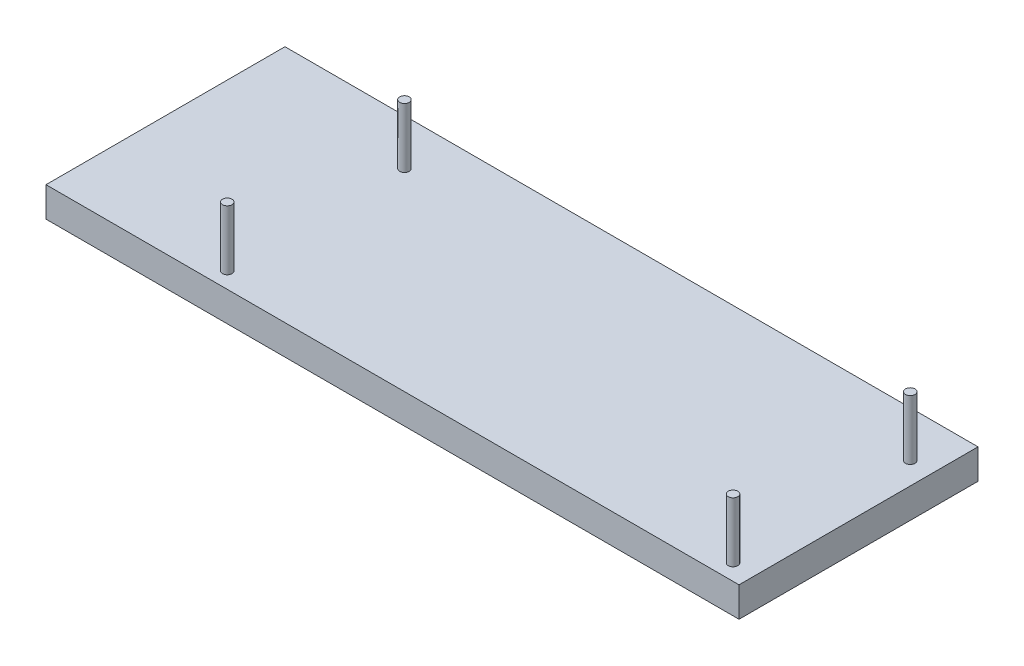
ISO-10303-21;
HEADER;
FILE_DESCRIPTION(('STEP AP214'),'2;1');
FILE_NAME('part.step','',(''),(''),'','','');
FILE_SCHEMA(('AUTOMOTIVE_DESIGN { 1 0 10303 214 1 1 1 1 }'));
ENDSEC;
DATA;
#1=APPLICATION_CONTEXT('core data for automotive mechanical design processes');
#2=APPLICATION_PROTOCOL_DEFINITION('international standard','automotive_design',2000,#1);
#3=PRODUCT_CONTEXT('',#1,'mechanical');
#4=PRODUCT('Part','Part','',(#3));
#5=PRODUCT_RELATED_PRODUCT_CATEGORY('part','',(#4));
#6=PRODUCT_DEFINITION_FORMATION('','',#4);
#7=PRODUCT_DEFINITION_CONTEXT('part definition',#1,'design');
#8=PRODUCT_DEFINITION('design','',#6,#7);
#9=PRODUCT_DEFINITION_SHAPE('','',#8);
#10=(LENGTH_UNIT() NAMED_UNIT(*) SI_UNIT(.MILLI.,.METRE.));
#11=(NAMED_UNIT(*) PLANE_ANGLE_UNIT() SI_UNIT($,.RADIAN.));
#12=(NAMED_UNIT(*) SI_UNIT($,.STERADIAN.) SOLID_ANGLE_UNIT());
#13=UNCERTAINTY_MEASURE_WITH_UNIT(LENGTH_MEASURE(1.E-05),#10,'distance_accuracy_value','');
#14=(GEOMETRIC_REPRESENTATION_CONTEXT(3) GLOBAL_UNCERTAINTY_ASSIGNED_CONTEXT((#13)) GLOBAL_UNIT_ASSIGNED_CONTEXT((#10,
#11,#12)) REPRESENTATION_CONTEXT('',''));
#15=CARTESIAN_POINT('',(0.,0.,0.));
#16=DIRECTION('',(0.,0.,1.));
#17=DIRECTION('',(1.,0.,0.));
#18=AXIS2_PLACEMENT_3D('',#15,#16,#17);
#19=CARTESIAN_POINT('',(-58.,5.,-40.));
#20=DIRECTION('',(1.,0.,0.));
#21=DIRECTION('',(0.,0.,-1.));
#22=AXIS2_PLACEMENT_3D('',#19,#20,#21);
#23=PLANE('',#22);
#24=DIRECTION('',(0.,0.,1.));
#25=VECTOR('',#24,1.);
#26=CARTESIAN_POINT('',(-58.,0.,-40.));
#27=LINE('',#26,#25);
#28=CARTESIAN_POINT('',(-58.,0.,-40.));
#29=VERTEX_POINT('',#28);
#30=CARTESIAN_POINT('',(-58.,0.,0.));
#31=VERTEX_POINT('',#30);
#32=EDGE_CURVE('E96',#29,#31,#27,.T.);
#33=ORIENTED_EDGE('',*,*,#32,.T.);
#34=DIRECTION('',(0.,-1.,0.));
#35=VECTOR('',#34,1.);
#36=CARTESIAN_POINT('',(-58.,5.,0.));
#37=LINE('',#36,#35);
#38=CARTESIAN_POINT('',(-58.,5.,0.));
#39=VERTEX_POINT('',#38);
#40=EDGE_CURVE('E11',#39,#31,#37,.T.);
#41=ORIENTED_EDGE('',*,*,#40,.F.);
#42=DIRECTION('',(0.,0.,1.));
#43=VECTOR('',#42,1.);
#44=CARTESIAN_POINT('',(-58.,5.,-40.));
#45=LINE('',#44,#43);
#46=CARTESIAN_POINT('',(-58.,5.,-40.));
#47=VERTEX_POINT('',#46);
#48=EDGE_CURVE('E84',#47,#39,#45,.T.);
#49=ORIENTED_EDGE('',*,*,#48,.F.);
#50=DIRECTION('',(0.,-1.,0.));
#51=VECTOR('',#50,1.);
#52=CARTESIAN_POINT('',(-58.,5.,-40.));
#53=LINE('',#52,#51);
#54=EDGE_CURVE('E92',#47,#29,#53,.T.);
#55=ORIENTED_EDGE('',*,*,#54,.T.);
#56=EDGE_LOOP('',(#33,#41,#49,#55));
#57=FACE_BOUND('',#56,.T.);
#58=ADVANCED_FACE('F33',(#57),#23,.F.);
#59=CARTESIAN_POINT('',(-58.,5.,0.));
#60=DIRECTION('',(0.,0.,-1.));
#61=DIRECTION('',(-1.,0.,0.));
#62=AXIS2_PLACEMENT_3D('',#59,#60,#61);
#63=PLANE('',#62);
#64=DIRECTION('',(1.,0.,0.));
#65=VECTOR('',#64,1.);
#66=CARTESIAN_POINT('',(-58.,0.,0.));
#67=LINE('',#66,#65);
#68=CARTESIAN_POINT('',(58.,0.,0.));
#69=VERTEX_POINT('',#68);
#70=EDGE_CURVE('E88',#31,#69,#67,.T.);
#71=ORIENTED_EDGE('',*,*,#70,.T.);
#72=DIRECTION('',(0.,-1.,0.));
#73=VECTOR('',#72,1.);
#74=CARTESIAN_POINT('',(58.,5.,0.));
#75=LINE('',#74,#73);
#76=CARTESIAN_POINT('',(58.,5.,0.));
#77=VERTEX_POINT('',#76);
#78=EDGE_CURVE('E41',#77,#69,#75,.T.);
#79=ORIENTED_EDGE('',*,*,#78,.F.);
#80=DIRECTION('',(1.,0.,0.));
#81=VECTOR('',#80,1.);
#82=CARTESIAN_POINT('',(-58.,5.,0.));
#83=LINE('',#82,#81);
#84=EDGE_CURVE('E79',#39,#77,#83,.T.);
#85=ORIENTED_EDGE('',*,*,#84,.F.);
#86=ORIENTED_EDGE('',*,*,#40,.T.);
#87=EDGE_LOOP('',(#71,#79,#85,#86));
#88=FACE_BOUND('',#87,.T.);
#89=ADVANCED_FACE('F87',(#88),#63,.F.);
#90=CARTESIAN_POINT('',(58.,5.,-40.));
#91=DIRECTION('',(-1.,0.,0.));
#92=DIRECTION('',(0.,0.,1.));
#93=AXIS2_PLACEMENT_3D('',#90,#91,#92);
#94=PLANE('',#93);
#95=DIRECTION('',(0.,0.,-1.));
#96=VECTOR('',#95,1.);
#97=CARTESIAN_POINT('',(58.,0.,-40.));
#98=LINE('',#97,#96);
#99=CARTESIAN_POINT('',(58.,0.,-40.));
#100=VERTEX_POINT('',#99);
#101=EDGE_CURVE('E66',#69,#100,#98,.T.);
#102=ORIENTED_EDGE('',*,*,#101,.T.);
#103=DIRECTION('',(0.,-1.,0.));
#104=VECTOR('',#103,1.);
#105=CARTESIAN_POINT('',(58.,5.,-40.));
#106=LINE('',#105,#104);
#107=CARTESIAN_POINT('',(58.,5.,-40.));
#108=VERTEX_POINT('',#107);
#109=EDGE_CURVE('E89',#108,#100,#106,.T.);
#110=ORIENTED_EDGE('',*,*,#109,.F.);
#111=DIRECTION('',(0.,0.,-1.));
#112=VECTOR('',#111,1.);
#113=CARTESIAN_POINT('',(58.,5.,-40.));
#114=LINE('',#113,#112);
#115=EDGE_CURVE('E82',#77,#108,#114,.T.);
#116=ORIENTED_EDGE('',*,*,#115,.F.);
#117=ORIENTED_EDGE('',*,*,#78,.T.);
#118=EDGE_LOOP('',(#102,#110,#116,#117));
#119=FACE_BOUND('',#118,.T.);
#120=ADVANCED_FACE('F90',(#119),#94,.F.);
#121=CARTESIAN_POINT('',(-58.,5.,-40.));
#122=DIRECTION('',(0.,0.,1.));
#123=DIRECTION('',(1.,0.,0.));
#124=AXIS2_PLACEMENT_3D('',#121,#122,#123);
#125=PLANE('',#124);
#126=DIRECTION('',(-1.,0.,0.));
#127=VECTOR('',#126,1.);
#128=CARTESIAN_POINT('',(-58.,0.,-40.));
#129=LINE('',#128,#127);
#130=EDGE_CURVE('E72',#100,#29,#129,.T.);
#131=ORIENTED_EDGE('',*,*,#130,.T.);
#132=ORIENTED_EDGE('',*,*,#54,.F.);
#133=DIRECTION('',(-1.,0.,0.));
#134=VECTOR('',#133,1.);
#135=CARTESIAN_POINT('',(-58.,5.,-40.));
#136=LINE('',#135,#134);
#137=EDGE_CURVE('E49',#108,#47,#136,.T.);
#138=ORIENTED_EDGE('',*,*,#137,.F.);
#139=ORIENTED_EDGE('',*,*,#109,.T.);
#140=EDGE_LOOP('',(#131,#132,#138,#139));
#141=FACE_BOUND('',#140,.T.);
#142=ADVANCED_FACE('F104',(#141),#125,.F.);
#143=CARTESIAN_POINT('',(0.,5.,0.));
#144=DIRECTION('',(0.,1.,0.));
#145=DIRECTION('',(0.,0.,1.));
#146=AXIS2_PLACEMENT_3D('',#143,#144,#145);
#147=PLANE('',#146);
#148=CARTESIAN_POINT('',(-30.33,5.,-32.33));
#149=DIRECTION('',(0.,1.,0.));
#150=DIRECTION('',(0.,0.,1.));
#151=AXIS2_PLACEMENT_3D('',#148,#149,#150);
#152=CIRCLE('',#151,0.800000000000003);
#153=CARTESIAN_POINT('',(-30.33,5.,-31.53));
#154=VERTEX_POINT('',#153);
#155=EDGE_CURVE('E125',#154,#154,#152,.T.);
#156=ORIENTED_EDGE('',*,*,#155,.F.);
#157=EDGE_LOOP('',(#156));
#158=FACE_BOUND('',#157,.T.);
#159=CARTESIAN_POINT('',(-30.33,5.,-2.67));
#160=DIRECTION('',(0.,1.,0.));
#161=DIRECTION('',(0.,0.,1.));
#162=AXIS2_PLACEMENT_3D('',#159,#160,#161);
#163=CIRCLE('',#162,0.800000000000003);
#164=CARTESIAN_POINT('',(-30.33,5.,-1.87));
#165=VERTEX_POINT('',#164);
#166=EDGE_CURVE('E119',#165,#165,#163,.T.);
#167=ORIENTED_EDGE('',*,*,#166,.F.);
#168=EDGE_LOOP('',(#167));
#169=FACE_BOUND('',#168,.T.);
#170=CARTESIAN_POINT('',(54.33,5.,-32.33));
#171=DIRECTION('',(0.,1.,0.));
#172=DIRECTION('',(0.,0.,1.));
#173=AXIS2_PLACEMENT_3D('',#170,#171,#172);
#174=CIRCLE('',#173,0.800000000000003);
#175=CARTESIAN_POINT('',(54.33,5.,-31.53));
#176=VERTEX_POINT('',#175);
#177=EDGE_CURVE('E113',#176,#176,#174,.T.);
#178=ORIENTED_EDGE('',*,*,#177,.F.);
#179=EDGE_LOOP('',(#178));
#180=FACE_BOUND('',#179,.T.);
#181=CARTESIAN_POINT('',(54.33,5.,-2.67));
#182=DIRECTION('',(0.,1.,0.));
#183=DIRECTION('',(0.,0.,1.));
#184=AXIS2_PLACEMENT_3D('',#181,#182,#183);
#185=CIRCLE('',#184,0.800000000000003);
#186=CARTESIAN_POINT('',(54.33,5.,-1.87));
#187=VERTEX_POINT('',#186);
#188=EDGE_CURVE('E110',#187,#187,#185,.T.);
#189=ORIENTED_EDGE('',*,*,#188,.F.);
#190=EDGE_LOOP('',(#189));
#191=FACE_BOUND('',#190,.T.);
#192=ORIENTED_EDGE('',*,*,#48,.T.);
#193=ORIENTED_EDGE('',*,*,#84,.T.);
#194=ORIENTED_EDGE('',*,*,#115,.T.);
#195=ORIENTED_EDGE('',*,*,#137,.T.);
#196=EDGE_LOOP('',(#192,#193,#194,#195));
#197=FACE_BOUND('',#196,.T.);
#198=ADVANCED_FACE('F80',(#158,#169,#180,#191,#197),#147,.T.);
#199=CARTESIAN_POINT('',(0.,0.,0.));
#200=DIRECTION('',(0.,1.,0.));
#201=DIRECTION('',(0.,0.,1.));
#202=AXIS2_PLACEMENT_3D('',#199,#200,#201);
#203=PLANE('',#202);
#204=ORIENTED_EDGE('',*,*,#32,.F.);
#205=ORIENTED_EDGE('',*,*,#130,.F.);
#206=ORIENTED_EDGE('',*,*,#101,.F.);
#207=ORIENTED_EDGE('',*,*,#70,.F.);
#208=EDGE_LOOP('',(#204,#205,#206,#207));
#209=FACE_BOUND('',#208,.T.);
#210=ADVANCED_FACE('F107',(#209),#203,.F.);
#211=CARTESIAN_POINT('',(54.33,15.,-2.67));
#212=DIRECTION('',(0.,-1.,0.));
#213=DIRECTION('',(0.,0.,-1.));
#214=AXIS2_PLACEMENT_3D('',#211,#212,#213);
#215=CYLINDRICAL_SURFACE('',#214,0.800000000000003);
#216=CARTESIAN_POINT('',(54.33,15.,-2.67));
#217=DIRECTION('',(0.,1.,0.));
#218=DIRECTION('',(0.,0.,1.));
#219=AXIS2_PLACEMENT_3D('',#216,#217,#218);
#220=CIRCLE('',#219,0.800000000000003);
#221=CARTESIAN_POINT('',(54.33,15.,-1.87));
#222=VERTEX_POINT('',#221);
#223=EDGE_CURVE('E99',#222,#222,#220,.T.);
#224=ORIENTED_EDGE('',*,*,#223,.F.);
#225=EDGE_LOOP('',(#224));
#226=FACE_BOUND('',#225,.T.);
#227=ORIENTED_EDGE('',*,*,#188,.T.);
#228=EDGE_LOOP('',(#227));
#229=FACE_BOUND('',#228,.T.);
#230=ADVANCED_FACE('F145',(#226,#229),#215,.T.);
#231=CARTESIAN_POINT('',(54.33,15.,-2.67));
#232=DIRECTION('',(0.,1.,0.));
#233=DIRECTION('',(0.,0.,1.));
#234=AXIS2_PLACEMENT_3D('',#231,#232,#233);
#235=PLANE('',#234);
#236=ORIENTED_EDGE('',*,*,#223,.T.);
#237=EDGE_LOOP('',(#236));
#238=FACE_BOUND('',#237,.T.);
#239=ADVANCED_FACE('F147',(#238),#235,.T.);
#240=CARTESIAN_POINT('',(54.33,15.,-32.33));
#241=DIRECTION('',(0.,-1.,0.));
#242=DIRECTION('',(0.,0.,-1.));
#243=AXIS2_PLACEMENT_3D('',#240,#241,#242);
#244=CYLINDRICAL_SURFACE('',#243,0.800000000000003);
#245=CARTESIAN_POINT('',(54.33,15.,-32.33));
#246=DIRECTION('',(0.,1.,0.));
#247=DIRECTION('',(0.,0.,1.));
#248=AXIS2_PLACEMENT_3D('',#245,#246,#247);
#249=CIRCLE('',#248,0.800000000000003);
#250=CARTESIAN_POINT('',(54.33,15.,-31.53));
#251=VERTEX_POINT('',#250);
#252=EDGE_CURVE('E116',#251,#251,#249,.T.);
#253=ORIENTED_EDGE('',*,*,#252,.F.);
#254=EDGE_LOOP('',(#253));
#255=FACE_BOUND('',#254,.T.);
#256=ORIENTED_EDGE('',*,*,#177,.T.);
#257=EDGE_LOOP('',(#256));
#258=FACE_BOUND('',#257,.T.);
#259=ADVANCED_FACE('F154',(#255,#258),#244,.T.);
#260=CARTESIAN_POINT('',(54.33,15.,-32.33));
#261=DIRECTION('',(0.,1.,0.));
#262=DIRECTION('',(0.,0.,1.));
#263=AXIS2_PLACEMENT_3D('',#260,#261,#262);
#264=PLANE('',#263);
#265=ORIENTED_EDGE('',*,*,#252,.T.);
#266=EDGE_LOOP('',(#265));
#267=FACE_BOUND('',#266,.T.);
#268=ADVANCED_FACE('F202',(#267),#264,.T.);
#269=CARTESIAN_POINT('',(-30.33,15.,-2.67));
#270=DIRECTION('',(0.,-1.,0.));
#271=DIRECTION('',(0.,0.,-1.));
#272=AXIS2_PLACEMENT_3D('',#269,#270,#271);
#273=CYLINDRICAL_SURFACE('',#272,0.800000000000003);
#274=CARTESIAN_POINT('',(-30.33,15.,-2.67));
#275=DIRECTION('',(0.,1.,0.));
#276=DIRECTION('',(0.,0.,1.));
#277=AXIS2_PLACEMENT_3D('',#274,#275,#276);
#278=CIRCLE('',#277,0.800000000000003);
#279=CARTESIAN_POINT('',(-30.33,15.,-1.87));
#280=VERTEX_POINT('',#279);
#281=EDGE_CURVE('E122',#280,#280,#278,.T.);
#282=ORIENTED_EDGE('',*,*,#281,.F.);
#283=EDGE_LOOP('',(#282));
#284=FACE_BOUND('',#283,.T.);
#285=ORIENTED_EDGE('',*,*,#166,.T.);
#286=EDGE_LOOP('',(#285));
#287=FACE_BOUND('',#286,.T.);
#288=ADVANCED_FACE('F211',(#284,#287),#273,.T.);
#289=CARTESIAN_POINT('',(-30.33,15.,-2.67));
#290=DIRECTION('',(0.,1.,0.));
#291=DIRECTION('',(0.,0.,1.));
#292=AXIS2_PLACEMENT_3D('',#289,#290,#291);
#293=PLANE('',#292);
#294=ORIENTED_EDGE('',*,*,#281,.T.);
#295=EDGE_LOOP('',(#294));
#296=FACE_BOUND('',#295,.T.);
#297=ADVANCED_FACE('F220',(#296),#293,.T.);
#298=CARTESIAN_POINT('',(-30.33,15.,-32.33));
#299=DIRECTION('',(0.,-1.,0.));
#300=DIRECTION('',(0.,0.,-1.));
#301=AXIS2_PLACEMENT_3D('',#298,#299,#300);
#302=CYLINDRICAL_SURFACE('',#301,0.800000000000003);
#303=CARTESIAN_POINT('',(-30.33,15.,-32.33));
#304=DIRECTION('',(0.,1.,0.));
#305=DIRECTION('',(0.,0.,1.));
#306=AXIS2_PLACEMENT_3D('',#303,#304,#305);
#307=CIRCLE('',#306,0.800000000000003);
#308=CARTESIAN_POINT('',(-30.33,15.,-31.53));
#309=VERTEX_POINT('',#308);
#310=EDGE_CURVE('E128',#309,#309,#307,.T.);
#311=ORIENTED_EDGE('',*,*,#310,.F.);
#312=EDGE_LOOP('',(#311));
#313=FACE_BOUND('',#312,.T.);
#314=ORIENTED_EDGE('',*,*,#155,.T.);
#315=EDGE_LOOP('',(#314));
#316=FACE_BOUND('',#315,.T.);
#317=ADVANCED_FACE('F134',(#313,#316),#302,.T.);
#318=CARTESIAN_POINT('',(-30.33,15.,-32.33));
#319=DIRECTION('',(0.,1.,0.));
#320=DIRECTION('',(0.,0.,1.));
#321=AXIS2_PLACEMENT_3D('',#318,#319,#320);
#322=PLANE('',#321);
#323=ORIENTED_EDGE('',*,*,#310,.T.);
#324=EDGE_LOOP('',(#323));
#325=FACE_BOUND('',#324,.T.);
#326=ADVANCED_FACE('F237',(#325),#322,.T.);
#327=CLOSED_SHELL('',(#58,#89,#120,#142,#198,#210,#230,#239,#259,#268,#288,#297,#317,#326));
#328=MANIFOLD_SOLID_BREP('B2',#327);
#329=ADVANCED_BREP_SHAPE_REPRESENTATION('',(#18,#328),#14);
#330=SHAPE_DEFINITION_REPRESENTATION(#9,#329);
ENDSEC;
END-ISO-10303-21;
